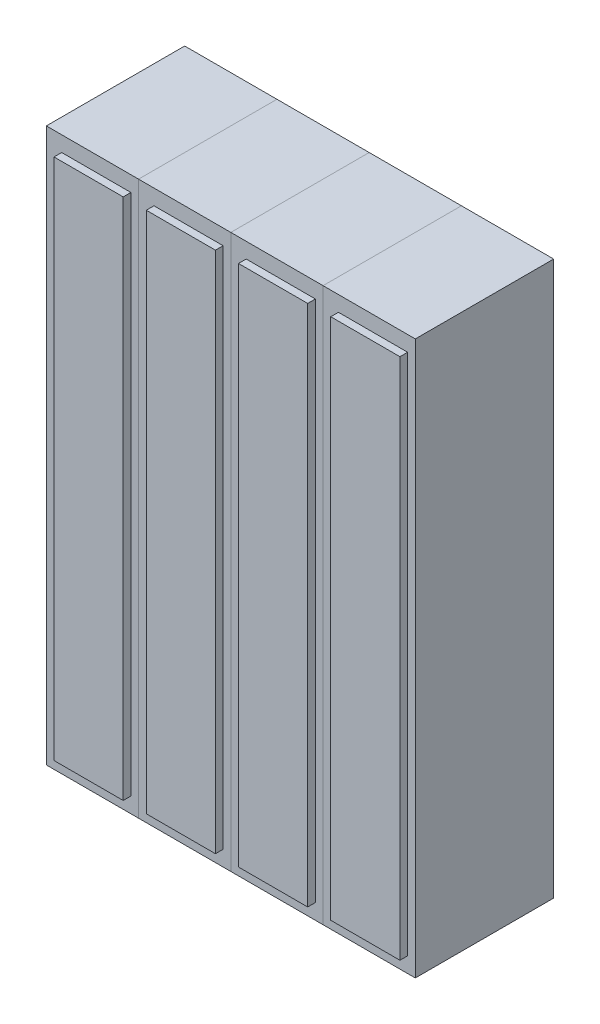
ISO-10303-21;
HEADER;
FILE_DESCRIPTION(('STEP AP214'),'2;1');
FILE_NAME('part.step','',(''),(''),'','','');
FILE_SCHEMA(('AUTOMOTIVE_DESIGN { 1 0 10303 214 1 1 1 1 }'));
ENDSEC;
DATA;
#1=APPLICATION_CONTEXT('core data for automotive mechanical design processes');
#2=APPLICATION_PROTOCOL_DEFINITION('international standard','automotive_design',2000,#1);
#3=PRODUCT_CONTEXT('',#1,'mechanical');
#4=PRODUCT('Part','Part','',(#3));
#5=PRODUCT_RELATED_PRODUCT_CATEGORY('part','',(#4));
#6=PRODUCT_DEFINITION_FORMATION('','',#4);
#7=PRODUCT_DEFINITION_CONTEXT('part definition',#1,'design');
#8=PRODUCT_DEFINITION('design','',#6,#7);
#9=PRODUCT_DEFINITION_SHAPE('','',#8);
#10=(LENGTH_UNIT() NAMED_UNIT(*) SI_UNIT(.MILLI.,.METRE.));
#11=(NAMED_UNIT(*) PLANE_ANGLE_UNIT() SI_UNIT($,.RADIAN.));
#12=(NAMED_UNIT(*) SI_UNIT($,.STERADIAN.) SOLID_ANGLE_UNIT());
#13=UNCERTAINTY_MEASURE_WITH_UNIT(LENGTH_MEASURE(1.E-05),#10,'distance_accuracy_value','');
#14=(GEOMETRIC_REPRESENTATION_CONTEXT(3) GLOBAL_UNCERTAINTY_ASSIGNED_CONTEXT((#13)) GLOBAL_UNIT_ASSIGNED_CONTEXT((#10,
#11,#12)) REPRESENTATION_CONTEXT('',''));
#15=CARTESIAN_POINT('',(0.,0.,0.));
#16=DIRECTION('',(0.,0.,1.));
#17=DIRECTION('',(1.,0.,0.));
#18=AXIS2_PLACEMENT_3D('',#15,#16,#17);
#19=CARTESIAN_POINT('',(914.4,1828.8,457.2));
#20=DIRECTION('',(0.,0.,-1.));
#21=DIRECTION('',(-1.,0.,0.));
#22=AXIS2_PLACEMENT_3D('',#19,#20,#21);
#23=PLANE('',#22);
#24=DIRECTION('',(1.,0.,0.));
#25=VECTOR('',#24,1.);
#26=CARTESIAN_POINT('',(914.4,0.,457.2));
#27=LINE('',#26,#25);
#28=CARTESIAN_POINT('',(914.4,0.,457.2));
#29=VERTEX_POINT('',#28);
#30=CARTESIAN_POINT('',(1219.2,0.,457.2));
#31=VERTEX_POINT('',#30);
#32=EDGE_CURVE('E138',#29,#31,#27,.T.);
#33=ORIENTED_EDGE('',*,*,#32,.T.);
#34=DIRECTION('',(0.,-1.,0.));
#35=VECTOR('',#34,1.);
#36=CARTESIAN_POINT('',(1219.2,1828.8,457.2));
#37=LINE('',#36,#35);
#38=CARTESIAN_POINT('',(1219.2,1828.8,457.2));
#39=VERTEX_POINT('',#38);
#40=EDGE_CURVE('E58',#39,#31,#37,.T.);
#41=ORIENTED_EDGE('',*,*,#40,.F.);
#42=DIRECTION('',(1.,0.,0.));
#43=VECTOR('',#42,1.);
#44=CARTESIAN_POINT('',(914.4,1828.8,457.2));
#45=LINE('',#44,#43);
#46=CARTESIAN_POINT('',(914.4,1828.8,457.2));
#47=VERTEX_POINT('',#46);
#48=EDGE_CURVE('E147',#47,#39,#45,.T.);
#49=ORIENTED_EDGE('',*,*,#48,.F.);
#50=DIRECTION('',(0.,-1.,0.));
#51=VECTOR('',#50,1.);
#52=CARTESIAN_POINT('',(914.4,1828.8,457.2));
#53=LINE('',#52,#51);
#54=EDGE_CURVE('E12',#47,#29,#53,.T.);
#55=ORIENTED_EDGE('',*,*,#54,.T.);
#56=EDGE_LOOP('',(#33,#41,#49,#55));
#57=FACE_BOUND('',#56,.T.);
#58=DIRECTION('',(0.,1.,0.));
#59=VECTOR('',#58,1.);
#60=CARTESIAN_POINT('',(1193.8,1778.,457.2));
#61=LINE('',#60,#59);
#62=CARTESIAN_POINT('',(1193.8,50.8,457.2));
#63=VERTEX_POINT('',#62);
#64=CARTESIAN_POINT('',(1193.8,1778.,457.2));
#65=VERTEX_POINT('',#64);
#66=EDGE_CURVE('E65',#63,#65,#61,.T.);
#67=ORIENTED_EDGE('',*,*,#66,.F.);
#68=DIRECTION('',(1.,0.,0.));
#69=VECTOR('',#68,1.);
#70=CARTESIAN_POINT('',(1193.8,50.8,457.2));
#71=LINE('',#70,#69);
#72=CARTESIAN_POINT('',(965.2,50.8,457.2));
#73=VERTEX_POINT('',#72);
#74=EDGE_CURVE('E69',#73,#63,#71,.T.);
#75=ORIENTED_EDGE('',*,*,#74,.F.);
#76=DIRECTION('',(0.,-1.,0.));
#77=VECTOR('',#76,1.);
#78=CARTESIAN_POINT('',(965.2,1778.,457.2));
#79=LINE('',#78,#77);
#80=CARTESIAN_POINT('',(965.2,1778.,457.2));
#81=VERTEX_POINT('',#80);
#82=EDGE_CURVE('E321',#81,#73,#79,.T.);
#83=ORIENTED_EDGE('',*,*,#82,.F.);
#84=DIRECTION('',(-1.,0.,0.));
#85=VECTOR('',#84,1.);
#86=CARTESIAN_POINT('',(1193.8,1778.,457.2));
#87=LINE('',#86,#85);
#88=EDGE_CURVE('E327',#65,#81,#87,.T.);
#89=ORIENTED_EDGE('',*,*,#88,.F.);
#90=EDGE_LOOP('',(#67,#75,#83,#89));
#91=FACE_BOUND('',#90,.T.);
#92=ADVANCED_FACE('F50',(#57,#91),#23,.F.);
#93=CARTESIAN_POINT('',(914.4,1828.8,0.));
#94=DIRECTION('',(1.,0.,0.));
#95=DIRECTION('',(0.,0.,-1.));
#96=AXIS2_PLACEMENT_3D('',#93,#94,#95);
#97=PLANE('',#96);
#98=DIRECTION('',(0.,0.,1.));
#99=VECTOR('',#98,1.);
#100=CARTESIAN_POINT('',(914.4,0.,0.));
#101=LINE('',#100,#99);
#102=CARTESIAN_POINT('',(914.4,0.,0.));
#103=VERTEX_POINT('',#102);
#104=EDGE_CURVE('E135',#103,#29,#101,.T.);
#105=ORIENTED_EDGE('',*,*,#104,.T.);
#106=ORIENTED_EDGE('',*,*,#54,.F.);
#107=DIRECTION('',(0.,0.,1.));
#108=VECTOR('',#107,1.);
#109=CARTESIAN_POINT('',(914.4,1828.8,0.));
#110=LINE('',#109,#108);
#111=CARTESIAN_POINT('',(914.4,1828.8,0.));
#112=VERTEX_POINT('',#111);
#113=EDGE_CURVE('E144',#112,#47,#110,.T.);
#114=ORIENTED_EDGE('',*,*,#113,.F.);
#115=DIRECTION('',(0.,-1.,0.));
#116=VECTOR('',#115,1.);
#117=CARTESIAN_POINT('',(914.4,1828.8,0.));
#118=LINE('',#117,#116);
#119=EDGE_CURVE('E153',#112,#103,#118,.T.);
#120=ORIENTED_EDGE('',*,*,#119,.T.);
#121=EDGE_LOOP('',(#105,#106,#114,#120));
#122=FACE_BOUND('',#121,.T.);
#123=ADVANCED_FACE('F52',(#122),#97,.F.);
#124=CARTESIAN_POINT('',(1219.2,1828.8,0.));
#125=DIRECTION('',(-1.,0.,0.));
#126=DIRECTION('',(0.,0.,1.));
#127=AXIS2_PLACEMENT_3D('',#124,#125,#126);
#128=PLANE('',#127);
#129=DIRECTION('',(0.,0.,-1.));
#130=VECTOR('',#129,1.);
#131=CARTESIAN_POINT('',(1219.2,0.,0.));
#132=LINE('',#131,#130);
#133=CARTESIAN_POINT('',(1219.2,0.,0.));
#134=VERTEX_POINT('',#133);
#135=EDGE_CURVE('E156',#31,#134,#132,.T.);
#136=ORIENTED_EDGE('',*,*,#135,.T.);
#137=DIRECTION('',(0.,-1.,0.));
#138=VECTOR('',#137,1.);
#139=CARTESIAN_POINT('',(1219.2,1828.8,0.));
#140=LINE('',#139,#138);
#141=CARTESIAN_POINT('',(1219.2,1828.8,0.));
#142=VERTEX_POINT('',#141);
#143=EDGE_CURVE('E161',#142,#134,#140,.T.);
#144=ORIENTED_EDGE('',*,*,#143,.F.);
#145=DIRECTION('',(0.,0.,-1.));
#146=VECTOR('',#145,1.);
#147=CARTESIAN_POINT('',(1219.2,1828.8,0.));
#148=LINE('',#147,#146);
#149=EDGE_CURVE('E150',#39,#142,#148,.T.);
#150=ORIENTED_EDGE('',*,*,#149,.F.);
#151=ORIENTED_EDGE('',*,*,#40,.T.);
#152=EDGE_LOOP('',(#136,#144,#150,#151));
#153=FACE_BOUND('',#152,.T.);
#154=ADVANCED_FACE('F168',(#153),#128,.F.);
#155=CARTESIAN_POINT('',(914.4,1828.8,0.));
#156=DIRECTION('',(0.,0.,1.));
#157=DIRECTION('',(1.,0.,0.));
#158=AXIS2_PLACEMENT_3D('',#155,#156,#157);
#159=PLANE('',#158);
#160=DIRECTION('',(-1.,0.,0.));
#161=VECTOR('',#160,1.);
#162=CARTESIAN_POINT('',(914.4,0.,0.));
#163=LINE('',#162,#161);
#164=EDGE_CURVE('E148',#134,#103,#163,.T.);
#165=ORIENTED_EDGE('',*,*,#164,.T.);
#166=ORIENTED_EDGE('',*,*,#119,.F.);
#167=DIRECTION('',(-1.,0.,0.));
#168=VECTOR('',#167,1.);
#169=CARTESIAN_POINT('',(914.4,1828.8,0.));
#170=LINE('',#169,#168);
#171=EDGE_CURVE('E152',#142,#112,#170,.T.);
#172=ORIENTED_EDGE('',*,*,#171,.F.);
#173=ORIENTED_EDGE('',*,*,#143,.T.);
#174=EDGE_LOOP('',(#165,#166,#172,#173));
#175=FACE_BOUND('',#174,.T.);
#176=ADVANCED_FACE('F177',(#175),#159,.F.);
#177=CARTESIAN_POINT('',(914.4,1828.8,0.));
#178=DIRECTION('',(0.,1.,0.));
#179=DIRECTION('',(0.,0.,1.));
#180=AXIS2_PLACEMENT_3D('',#177,#178,#179);
#181=PLANE('',#180);
#182=ORIENTED_EDGE('',*,*,#113,.T.);
#183=ORIENTED_EDGE('',*,*,#48,.T.);
#184=ORIENTED_EDGE('',*,*,#149,.T.);
#185=ORIENTED_EDGE('',*,*,#171,.T.);
#186=EDGE_LOOP('',(#182,#183,#184,#185));
#187=FACE_BOUND('',#186,.T.);
#188=ADVANCED_FACE('F183',(#187),#181,.T.);
#189=CARTESIAN_POINT('',(914.4,0.,0.));
#190=DIRECTION('',(0.,1.,0.));
#191=DIRECTION('',(0.,0.,1.));
#192=AXIS2_PLACEMENT_3D('',#189,#190,#191);
#193=PLANE('',#192);
#194=ORIENTED_EDGE('',*,*,#104,.F.);
#195=ORIENTED_EDGE('',*,*,#164,.F.);
#196=ORIENTED_EDGE('',*,*,#135,.F.);
#197=ORIENTED_EDGE('',*,*,#32,.F.);
#198=EDGE_LOOP('',(#194,#195,#196,#197));
#199=FACE_BOUND('',#198,.T.);
#200=ADVANCED_FACE('F174',(#199),#193,.F.);
#201=CARTESIAN_POINT('',(1193.8,1778.,482.6));
#202=DIRECTION('',(-1.,0.,0.));
#203=DIRECTION('',(0.,-1.,0.));
#204=AXIS2_PLACEMENT_3D('',#201,#202,#203);
#205=PLANE('',#204);
#206=ORIENTED_EDGE('',*,*,#66,.T.);
#207=DIRECTION('',(0.,0.,-1.));
#208=VECTOR('',#207,1.);
#209=CARTESIAN_POINT('',(1193.8,1778.,482.6));
#210=LINE('',#209,#208);
#211=CARTESIAN_POINT('',(1193.8,1778.,482.6));
#212=VERTEX_POINT('',#211);
#213=EDGE_CURVE('E118',#212,#65,#210,.T.);
#214=ORIENTED_EDGE('',*,*,#213,.F.);
#215=DIRECTION('',(0.,1.,0.));
#216=VECTOR('',#215,1.);
#217=CARTESIAN_POINT('',(1193.8,1778.,482.6));
#218=LINE('',#217,#216);
#219=CARTESIAN_POINT('',(1193.8,50.8,482.6));
#220=VERTEX_POINT('',#219);
#221=EDGE_CURVE('E124',#220,#212,#218,.T.);
#222=ORIENTED_EDGE('',*,*,#221,.F.);
#223=DIRECTION('',(0.,0.,-1.));
#224=VECTOR('',#223,1.);
#225=CARTESIAN_POINT('',(1193.8,50.8,482.6));
#226=LINE('',#225,#224);
#227=EDGE_CURVE('E319',#220,#63,#226,.T.);
#228=ORIENTED_EDGE('',*,*,#227,.T.);
#229=EDGE_LOOP('',(#206,#214,#222,#228));
#230=FACE_BOUND('',#229,.T.);
#231=ADVANCED_FACE('F134',(#230),#205,.F.);
#232=CARTESIAN_POINT('',(1193.8,1778.,482.6));
#233=DIRECTION('',(0.,-1.,0.));
#234=DIRECTION('',(0.,0.,-1.));
#235=AXIS2_PLACEMENT_3D('',#232,#233,#234);
#236=PLANE('',#235);
#237=ORIENTED_EDGE('',*,*,#88,.T.);
#238=DIRECTION('',(0.,0.,-1.));
#239=VECTOR('',#238,1.);
#240=CARTESIAN_POINT('',(965.2,1778.,482.6));
#241=LINE('',#240,#239);
#242=CARTESIAN_POINT('',(965.2,1778.,482.6));
#243=VERTEX_POINT('',#242);
#244=EDGE_CURVE('E120',#243,#81,#241,.T.);
#245=ORIENTED_EDGE('',*,*,#244,.F.);
#246=DIRECTION('',(-1.,0.,0.));
#247=VECTOR('',#246,1.);
#248=CARTESIAN_POINT('',(1193.8,1778.,482.6));
#249=LINE('',#248,#247);
#250=EDGE_CURVE('E113',#212,#243,#249,.T.);
#251=ORIENTED_EDGE('',*,*,#250,.F.);
#252=ORIENTED_EDGE('',*,*,#213,.T.);
#253=EDGE_LOOP('',(#237,#245,#251,#252));
#254=FACE_BOUND('',#253,.T.);
#255=ADVANCED_FACE('F116',(#254),#236,.F.);
#256=CARTESIAN_POINT('',(965.2,1778.,482.6));
#257=DIRECTION('',(1.,0.,0.));
#258=DIRECTION('',(0.,1.,0.));
#259=AXIS2_PLACEMENT_3D('',#256,#257,#258);
#260=PLANE('',#259);
#261=ORIENTED_EDGE('',*,*,#82,.T.);
#262=DIRECTION('',(0.,0.,-1.));
#263=VECTOR('',#262,1.);
#264=CARTESIAN_POINT('',(965.2,50.8,482.6));
#265=LINE('',#264,#263);
#266=CARTESIAN_POINT('',(965.2,50.8,482.6));
#267=VERTEX_POINT('',#266);
#268=EDGE_CURVE('E140',#267,#73,#265,.T.);
#269=ORIENTED_EDGE('',*,*,#268,.F.);
#270=DIRECTION('',(0.,-1.,0.));
#271=VECTOR('',#270,1.);
#272=CARTESIAN_POINT('',(965.2,1778.,482.6));
#273=LINE('',#272,#271);
#274=EDGE_CURVE('E123',#243,#267,#273,.T.);
#275=ORIENTED_EDGE('',*,*,#274,.F.);
#276=ORIENTED_EDGE('',*,*,#244,.T.);
#277=EDGE_LOOP('',(#261,#269,#275,#276));
#278=FACE_BOUND('',#277,.T.);
#279=ADVANCED_FACE('F201',(#278),#260,.F.);
#280=CARTESIAN_POINT('',(1193.8,50.8,482.6));
#281=DIRECTION('',(0.,1.,0.));
#282=DIRECTION('',(-1.,0.,0.));
#283=AXIS2_PLACEMENT_3D('',#280,#281,#282);
#284=PLANE('',#283);
#285=ORIENTED_EDGE('',*,*,#74,.T.);
#286=ORIENTED_EDGE('',*,*,#227,.F.);
#287=DIRECTION('',(1.,0.,0.));
#288=VECTOR('',#287,1.);
#289=CARTESIAN_POINT('',(1193.8,50.8,482.6));
#290=LINE('',#289,#288);
#291=EDGE_CURVE('E129',#267,#220,#290,.T.);
#292=ORIENTED_EDGE('',*,*,#291,.F.);
#293=ORIENTED_EDGE('',*,*,#268,.T.);
#294=EDGE_LOOP('',(#285,#286,#292,#293));
#295=FACE_BOUND('',#294,.T.);
#296=ADVANCED_FACE('F204',(#295),#284,.F.);
#297=CARTESIAN_POINT('',(914.4,0.,482.6));
#298=DIRECTION('',(0.,0.,-1.));
#299=DIRECTION('',(-1.,0.,0.));
#300=AXIS2_PLACEMENT_3D('',#297,#298,#299);
#301=PLANE('',#300);
#302=ORIENTED_EDGE('',*,*,#221,.T.);
#303=ORIENTED_EDGE('',*,*,#250,.T.);
#304=ORIENTED_EDGE('',*,*,#274,.T.);
#305=ORIENTED_EDGE('',*,*,#291,.T.);
#306=EDGE_LOOP('',(#302,#303,#304,#305));
#307=FACE_BOUND('',#306,.T.);
#308=ADVANCED_FACE('F127',(#307),#301,.F.);
#309=CLOSED_SHELL('',(#92,#123,#154,#176,#188,#200,#231,#255,#279,#296,#308));
#310=MANIFOLD_SOLID_BREP('B2',#309);
#311=CARTESIAN_POINT('',(609.6,1828.8,457.2));
#312=DIRECTION('',(0.,0.,-1.));
#313=DIRECTION('',(-1.,0.,0.));
#314=AXIS2_PLACEMENT_3D('',#311,#312,#313);
#315=PLANE('',#314);
#316=DIRECTION('',(1.,0.,0.));
#317=VECTOR('',#316,1.);
#318=CARTESIAN_POINT('',(609.6,0.,457.2));
#319=LINE('',#318,#317);
#320=CARTESIAN_POINT('',(609.6,0.,457.2));
#321=VERTEX_POINT('',#320);
#322=CARTESIAN_POINT('',(914.4,0.,457.2));
#323=VERTEX_POINT('',#322);
#324=EDGE_CURVE('E431',#321,#323,#319,.T.);
#325=ORIENTED_EDGE('',*,*,#324,.T.);
#326=DIRECTION('',(0.,-1.,0.));
#327=VECTOR('',#326,1.);
#328=CARTESIAN_POINT('',(914.4,1828.8,457.2));
#329=LINE('',#328,#327);
#330=CARTESIAN_POINT('',(914.4,1828.8,457.2));
#331=VERTEX_POINT('',#330);
#332=EDGE_CURVE('E351',#331,#323,#329,.T.);
#333=ORIENTED_EDGE('',*,*,#332,.F.);
#334=DIRECTION('',(1.,0.,0.));
#335=VECTOR('',#334,1.);
#336=CARTESIAN_POINT('',(609.6,1828.8,457.2));
#337=LINE('',#336,#335);
#338=CARTESIAN_POINT('',(609.6,1828.8,457.2));
#339=VERTEX_POINT('',#338);
#340=EDGE_CURVE('E440',#339,#331,#337,.T.);
#341=ORIENTED_EDGE('',*,*,#340,.F.);
#342=DIRECTION('',(0.,-1.,0.));
#343=VECTOR('',#342,1.);
#344=CARTESIAN_POINT('',(609.6,1828.8,457.2));
#345=LINE('',#344,#343);
#346=EDGE_CURVE('E48',#339,#321,#345,.T.);
#347=ORIENTED_EDGE('',*,*,#346,.T.);
#348=EDGE_LOOP('',(#325,#333,#341,#347));
#349=FACE_BOUND('',#348,.T.);
#350=DIRECTION('',(0.,1.,0.));
#351=VECTOR('',#350,1.);
#352=CARTESIAN_POINT('',(889.,1778.,457.2));
#353=LINE('',#352,#351);
#354=CARTESIAN_POINT('',(889.,50.8,457.2));
#355=VERTEX_POINT('',#354);
#356=CARTESIAN_POINT('',(889.,1778.,457.2));
#357=VERTEX_POINT('',#356);
#358=EDGE_CURVE('E358',#355,#357,#353,.T.);
#359=ORIENTED_EDGE('',*,*,#358,.F.);
#360=DIRECTION('',(1.,0.,0.));
#361=VECTOR('',#360,1.);
#362=CARTESIAN_POINT('',(889.,50.8,457.2));
#363=LINE('',#362,#361);
#364=CARTESIAN_POINT('',(660.4,50.8,457.2));
#365=VERTEX_POINT('',#364);
#366=EDGE_CURVE('E362',#365,#355,#363,.T.);
#367=ORIENTED_EDGE('',*,*,#366,.F.);
#368=DIRECTION('',(0.,-1.,0.));
#369=VECTOR('',#368,1.);
#370=CARTESIAN_POINT('',(660.4,1778.,457.2));
#371=LINE('',#370,#369);
#372=CARTESIAN_POINT('',(660.4,1778.,457.2));
#373=VERTEX_POINT('',#372);
#374=EDGE_CURVE('E614',#373,#365,#371,.T.);
#375=ORIENTED_EDGE('',*,*,#374,.F.);
#376=DIRECTION('',(-1.,0.,0.));
#377=VECTOR('',#376,1.);
#378=CARTESIAN_POINT('',(889.,1778.,457.2));
#379=LINE('',#378,#377);
#380=EDGE_CURVE('E620',#357,#373,#379,.T.);
#381=ORIENTED_EDGE('',*,*,#380,.F.);
#382=EDGE_LOOP('',(#359,#367,#375,#381));
#383=FACE_BOUND('',#382,.T.);
#384=ADVANCED_FACE('F343',(#349,#383),#315,.F.);
#385=CARTESIAN_POINT('',(609.6,1828.8,0.));
#386=DIRECTION('',(1.,0.,0.));
#387=DIRECTION('',(0.,0.,-1.));
#388=AXIS2_PLACEMENT_3D('',#385,#386,#387);
#389=PLANE('',#388);
#390=DIRECTION('',(0.,0.,1.));
#391=VECTOR('',#390,1.);
#392=CARTESIAN_POINT('',(609.6,0.,0.));
#393=LINE('',#392,#391);
#394=CARTESIAN_POINT('',(609.6,0.,0.));
#395=VERTEX_POINT('',#394);
#396=EDGE_CURVE('E428',#395,#321,#393,.T.);
#397=ORIENTED_EDGE('',*,*,#396,.T.);
#398=ORIENTED_EDGE('',*,*,#346,.F.);
#399=DIRECTION('',(0.,0.,1.));
#400=VECTOR('',#399,1.);
#401=CARTESIAN_POINT('',(609.6,1828.8,0.));
#402=LINE('',#401,#400);
#403=CARTESIAN_POINT('',(609.6,1828.8,0.));
#404=VERTEX_POINT('',#403);
#405=EDGE_CURVE('E437',#404,#339,#402,.T.);
#406=ORIENTED_EDGE('',*,*,#405,.F.);
#407=DIRECTION('',(0.,-1.,0.));
#408=VECTOR('',#407,1.);
#409=CARTESIAN_POINT('',(609.6,1828.8,0.));
#410=LINE('',#409,#408);
#411=EDGE_CURVE('E446',#404,#395,#410,.T.);
#412=ORIENTED_EDGE('',*,*,#411,.T.);
#413=EDGE_LOOP('',(#397,#398,#406,#412));
#414=FACE_BOUND('',#413,.T.);
#415=ADVANCED_FACE('F345',(#414),#389,.F.);
#416=CARTESIAN_POINT('',(914.4,1828.8,0.));
#417=DIRECTION('',(-1.,0.,0.));
#418=DIRECTION('',(0.,0.,1.));
#419=AXIS2_PLACEMENT_3D('',#416,#417,#418);
#420=PLANE('',#419);
#421=DIRECTION('',(0.,0.,-1.));
#422=VECTOR('',#421,1.);
#423=CARTESIAN_POINT('',(914.4,0.,0.));
#424=LINE('',#423,#422);
#425=CARTESIAN_POINT('',(914.4,0.,0.));
#426=VERTEX_POINT('',#425);
#427=EDGE_CURVE('E449',#323,#426,#424,.T.);
#428=ORIENTED_EDGE('',*,*,#427,.T.);
#429=DIRECTION('',(0.,-1.,0.));
#430=VECTOR('',#429,1.);
#431=CARTESIAN_POINT('',(914.4,1828.8,0.));
#432=LINE('',#431,#430);
#433=CARTESIAN_POINT('',(914.4,1828.8,0.));
#434=VERTEX_POINT('',#433);
#435=EDGE_CURVE('E454',#434,#426,#432,.T.);
#436=ORIENTED_EDGE('',*,*,#435,.F.);
#437=DIRECTION('',(0.,0.,-1.));
#438=VECTOR('',#437,1.);
#439=CARTESIAN_POINT('',(914.4,1828.8,0.));
#440=LINE('',#439,#438);
#441=EDGE_CURVE('E443',#331,#434,#440,.T.);
#442=ORIENTED_EDGE('',*,*,#441,.F.);
#443=ORIENTED_EDGE('',*,*,#332,.T.);
#444=EDGE_LOOP('',(#428,#436,#442,#443));
#445=FACE_BOUND('',#444,.T.);
#446=ADVANCED_FACE('F461',(#445),#420,.F.);
#447=CARTESIAN_POINT('',(609.6,1828.8,0.));
#448=DIRECTION('',(0.,0.,1.));
#449=DIRECTION('',(1.,0.,0.));
#450=AXIS2_PLACEMENT_3D('',#447,#448,#449);
#451=PLANE('',#450);
#452=DIRECTION('',(-1.,0.,0.));
#453=VECTOR('',#452,1.);
#454=CARTESIAN_POINT('',(609.6,0.,0.));
#455=LINE('',#454,#453);
#456=EDGE_CURVE('E441',#426,#395,#455,.T.);
#457=ORIENTED_EDGE('',*,*,#456,.T.);
#458=ORIENTED_EDGE('',*,*,#411,.F.);
#459=DIRECTION('',(-1.,0.,0.));
#460=VECTOR('',#459,1.);
#461=CARTESIAN_POINT('',(609.6,1828.8,0.));
#462=LINE('',#461,#460);
#463=EDGE_CURVE('E445',#434,#404,#462,.T.);
#464=ORIENTED_EDGE('',*,*,#463,.F.);
#465=ORIENTED_EDGE('',*,*,#435,.T.);
#466=EDGE_LOOP('',(#457,#458,#464,#465));
#467=FACE_BOUND('',#466,.T.);
#468=ADVANCED_FACE('F470',(#467),#451,.F.);
#469=CARTESIAN_POINT('',(609.6,1828.8,0.));
#470=DIRECTION('',(0.,1.,0.));
#471=DIRECTION('',(0.,0.,1.));
#472=AXIS2_PLACEMENT_3D('',#469,#470,#471);
#473=PLANE('',#472);
#474=ORIENTED_EDGE('',*,*,#405,.T.);
#475=ORIENTED_EDGE('',*,*,#340,.T.);
#476=ORIENTED_EDGE('',*,*,#441,.T.);
#477=ORIENTED_EDGE('',*,*,#463,.T.);
#478=EDGE_LOOP('',(#474,#475,#476,#477));
#479=FACE_BOUND('',#478,.T.);
#480=ADVANCED_FACE('F476',(#479),#473,.T.);
#481=CARTESIAN_POINT('',(609.6,0.,0.));
#482=DIRECTION('',(0.,1.,0.));
#483=DIRECTION('',(0.,0.,1.));
#484=AXIS2_PLACEMENT_3D('',#481,#482,#483);
#485=PLANE('',#484);
#486=ORIENTED_EDGE('',*,*,#396,.F.);
#487=ORIENTED_EDGE('',*,*,#456,.F.);
#488=ORIENTED_EDGE('',*,*,#427,.F.);
#489=ORIENTED_EDGE('',*,*,#324,.F.);
#490=EDGE_LOOP('',(#486,#487,#488,#489));
#491=FACE_BOUND('',#490,.T.);
#492=ADVANCED_FACE('F467',(#491),#485,.F.);
#493=CARTESIAN_POINT('',(889.,1778.,482.6));
#494=DIRECTION('',(-1.,0.,0.));
#495=DIRECTION('',(0.,-1.,0.));
#496=AXIS2_PLACEMENT_3D('',#493,#494,#495);
#497=PLANE('',#496);
#498=ORIENTED_EDGE('',*,*,#358,.T.);
#499=DIRECTION('',(0.,0.,-1.));
#500=VECTOR('',#499,1.);
#501=CARTESIAN_POINT('',(889.,1778.,482.6));
#502=LINE('',#501,#500);
#503=CARTESIAN_POINT('',(889.,1778.,482.6));
#504=VERTEX_POINT('',#503);
#505=EDGE_CURVE('E411',#504,#357,#502,.T.);
#506=ORIENTED_EDGE('',*,*,#505,.F.);
#507=DIRECTION('',(0.,1.,0.));
#508=VECTOR('',#507,1.);
#509=CARTESIAN_POINT('',(889.,1778.,482.6));
#510=LINE('',#509,#508);
#511=CARTESIAN_POINT('',(889.,50.8,482.6));
#512=VERTEX_POINT('',#511);
#513=EDGE_CURVE('E417',#512,#504,#510,.T.);
#514=ORIENTED_EDGE('',*,*,#513,.F.);
#515=DIRECTION('',(0.,0.,-1.));
#516=VECTOR('',#515,1.);
#517=CARTESIAN_POINT('',(889.,50.8,482.6));
#518=LINE('',#517,#516);
#519=EDGE_CURVE('E612',#512,#355,#518,.T.);
#520=ORIENTED_EDGE('',*,*,#519,.T.);
#521=EDGE_LOOP('',(#498,#506,#514,#520));
#522=FACE_BOUND('',#521,.T.);
#523=ADVANCED_FACE('F427',(#522),#497,.F.);
#524=CARTESIAN_POINT('',(889.,1778.,482.6));
#525=DIRECTION('',(0.,-1.,0.));
#526=DIRECTION('',(0.,0.,-1.));
#527=AXIS2_PLACEMENT_3D('',#524,#525,#526);
#528=PLANE('',#527);
#529=ORIENTED_EDGE('',*,*,#380,.T.);
#530=DIRECTION('',(0.,0.,-1.));
#531=VECTOR('',#530,1.);
#532=CARTESIAN_POINT('',(660.4,1778.,482.6));
#533=LINE('',#532,#531);
#534=CARTESIAN_POINT('',(660.4,1778.,482.6));
#535=VERTEX_POINT('',#534);
#536=EDGE_CURVE('E413',#535,#373,#533,.T.);
#537=ORIENTED_EDGE('',*,*,#536,.F.);
#538=DIRECTION('',(-1.,0.,0.));
#539=VECTOR('',#538,1.);
#540=CARTESIAN_POINT('',(889.,1778.,482.6));
#541=LINE('',#540,#539);
#542=EDGE_CURVE('E406',#504,#535,#541,.T.);
#543=ORIENTED_EDGE('',*,*,#542,.F.);
#544=ORIENTED_EDGE('',*,*,#505,.T.);
#545=EDGE_LOOP('',(#529,#537,#543,#544));
#546=FACE_BOUND('',#545,.T.);
#547=ADVANCED_FACE('F409',(#546),#528,.F.);
#548=CARTESIAN_POINT('',(660.4,1778.,482.6));
#549=DIRECTION('',(1.,0.,0.));
#550=DIRECTION('',(0.,1.,0.));
#551=AXIS2_PLACEMENT_3D('',#548,#549,#550);
#552=PLANE('',#551);
#553=ORIENTED_EDGE('',*,*,#374,.T.);
#554=DIRECTION('',(0.,0.,-1.));
#555=VECTOR('',#554,1.);
#556=CARTESIAN_POINT('',(660.4,50.8,482.6));
#557=LINE('',#556,#555);
#558=CARTESIAN_POINT('',(660.4,50.8,482.6));
#559=VERTEX_POINT('',#558);
#560=EDGE_CURVE('E433',#559,#365,#557,.T.);
#561=ORIENTED_EDGE('',*,*,#560,.F.);
#562=DIRECTION('',(0.,-1.,0.));
#563=VECTOR('',#562,1.);
#564=CARTESIAN_POINT('',(660.4,1778.,482.6));
#565=LINE('',#564,#563);
#566=EDGE_CURVE('E416',#535,#559,#565,.T.);
#567=ORIENTED_EDGE('',*,*,#566,.F.);
#568=ORIENTED_EDGE('',*,*,#536,.T.);
#569=EDGE_LOOP('',(#553,#561,#567,#568));
#570=FACE_BOUND('',#569,.T.);
#571=ADVANCED_FACE('F494',(#570),#552,.F.);
#572=CARTESIAN_POINT('',(889.,50.8,482.6));
#573=DIRECTION('',(0.,1.,0.));
#574=DIRECTION('',(-1.,0.,0.));
#575=AXIS2_PLACEMENT_3D('',#572,#573,#574);
#576=PLANE('',#575);
#577=ORIENTED_EDGE('',*,*,#366,.T.);
#578=ORIENTED_EDGE('',*,*,#519,.F.);
#579=DIRECTION('',(1.,0.,0.));
#580=VECTOR('',#579,1.);
#581=CARTESIAN_POINT('',(889.,50.8,482.6));
#582=LINE('',#581,#580);
#583=EDGE_CURVE('E422',#559,#512,#582,.T.);
#584=ORIENTED_EDGE('',*,*,#583,.F.);
#585=ORIENTED_EDGE('',*,*,#560,.T.);
#586=EDGE_LOOP('',(#577,#578,#584,#585));
#587=FACE_BOUND('',#586,.T.);
#588=ADVANCED_FACE('F497',(#587),#576,.F.);
#589=CARTESIAN_POINT('',(609.6,0.,482.6));
#590=DIRECTION('',(0.,0.,-1.));
#591=DIRECTION('',(-1.,0.,0.));
#592=AXIS2_PLACEMENT_3D('',#589,#590,#591);
#593=PLANE('',#592);
#594=ORIENTED_EDGE('',*,*,#513,.T.);
#595=ORIENTED_EDGE('',*,*,#542,.T.);
#596=ORIENTED_EDGE('',*,*,#566,.T.);
#597=ORIENTED_EDGE('',*,*,#583,.T.);
#598=EDGE_LOOP('',(#594,#595,#596,#597));
#599=FACE_BOUND('',#598,.T.);
#600=ADVANCED_FACE('F420',(#599),#593,.F.);
#601=CLOSED_SHELL('',(#384,#415,#446,#468,#480,#492,#523,#547,#571,#588,#600));
#602=MANIFOLD_SOLID_BREP('B6',#601);
#603=CARTESIAN_POINT('',(304.8,1828.8,457.2));
#604=DIRECTION('',(0.,0.,-1.));
#605=DIRECTION('',(-1.,0.,0.));
#606=AXIS2_PLACEMENT_3D('',#603,#604,#605);
#607=PLANE('',#606);
#608=DIRECTION('',(1.,0.,0.));
#609=VECTOR('',#608,1.);
#610=CARTESIAN_POINT('',(304.8,0.,457.2));
#611=LINE('',#610,#609);
#612=CARTESIAN_POINT('',(304.8,0.,457.2));
#613=VERTEX_POINT('',#612);
#614=CARTESIAN_POINT('',(609.6,0.,457.2));
#615=VERTEX_POINT('',#614);
#616=EDGE_CURVE('E723',#613,#615,#611,.T.);
#617=ORIENTED_EDGE('',*,*,#616,.T.);
#618=DIRECTION('',(0.,-1.,0.));
#619=VECTOR('',#618,1.);
#620=CARTESIAN_POINT('',(609.6,1828.8,457.2));
#621=LINE('',#620,#619);
#622=CARTESIAN_POINT('',(609.6,1828.8,457.2));
#623=VERTEX_POINT('',#622);
#624=EDGE_CURVE('E643',#623,#615,#621,.T.);
#625=ORIENTED_EDGE('',*,*,#624,.F.);
#626=DIRECTION('',(1.,0.,0.));
#627=VECTOR('',#626,1.);
#628=CARTESIAN_POINT('',(304.8,1828.8,457.2));
#629=LINE('',#628,#627);
#630=CARTESIAN_POINT('',(304.8,1828.8,457.2));
#631=VERTEX_POINT('',#630);
#632=EDGE_CURVE('E732',#631,#623,#629,.T.);
#633=ORIENTED_EDGE('',*,*,#632,.F.);
#634=DIRECTION('',(0.,-1.,0.));
#635=VECTOR('',#634,1.);
#636=CARTESIAN_POINT('',(304.8,1828.8,457.2));
#637=LINE('',#636,#635);
#638=EDGE_CURVE('E341',#631,#613,#637,.T.);
#639=ORIENTED_EDGE('',*,*,#638,.T.);
#640=EDGE_LOOP('',(#617,#625,#633,#639));
#641=FACE_BOUND('',#640,.T.);
#642=DIRECTION('',(0.,1.,0.));
#643=VECTOR('',#642,1.);
#644=CARTESIAN_POINT('',(584.2,1778.,457.2));
#645=LINE('',#644,#643);
#646=CARTESIAN_POINT('',(584.2,50.8,457.2));
#647=VERTEX_POINT('',#646);
#648=CARTESIAN_POINT('',(584.2,1778.,457.2));
#649=VERTEX_POINT('',#648);
#650=EDGE_CURVE('E650',#647,#649,#645,.T.);
#651=ORIENTED_EDGE('',*,*,#650,.F.);
#652=DIRECTION('',(1.,0.,0.));
#653=VECTOR('',#652,1.);
#654=CARTESIAN_POINT('',(584.2,50.8,457.2));
#655=LINE('',#654,#653);
#656=CARTESIAN_POINT('',(355.6,50.8,457.2));
#657=VERTEX_POINT('',#656);
#658=EDGE_CURVE('E654',#657,#647,#655,.T.);
#659=ORIENTED_EDGE('',*,*,#658,.F.);
#660=DIRECTION('',(0.,-1.,0.));
#661=VECTOR('',#660,1.);
#662=CARTESIAN_POINT('',(355.6,1778.,457.2));
#663=LINE('',#662,#661);
#664=CARTESIAN_POINT('',(355.6,1778.,457.2));
#665=VERTEX_POINT('',#664);
#666=EDGE_CURVE('E906',#665,#657,#663,.T.);
#667=ORIENTED_EDGE('',*,*,#666,.F.);
#668=DIRECTION('',(-1.,0.,0.));
#669=VECTOR('',#668,1.);
#670=CARTESIAN_POINT('',(584.2,1778.,457.2));
#671=LINE('',#670,#669);
#672=EDGE_CURVE('E912',#649,#665,#671,.T.);
#673=ORIENTED_EDGE('',*,*,#672,.F.);
#674=EDGE_LOOP('',(#651,#659,#667,#673));
#675=FACE_BOUND('',#674,.T.);
#676=ADVANCED_FACE('F635',(#641,#675),#607,.F.);
#677=CARTESIAN_POINT('',(304.8,1828.8,0.));
#678=DIRECTION('',(1.,0.,0.));
#679=DIRECTION('',(0.,0.,-1.));
#680=AXIS2_PLACEMENT_3D('',#677,#678,#679);
#681=PLANE('',#680);
#682=DIRECTION('',(0.,0.,1.));
#683=VECTOR('',#682,1.);
#684=CARTESIAN_POINT('',(304.8,0.,0.));
#685=LINE('',#684,#683);
#686=CARTESIAN_POINT('',(304.8,0.,0.));
#687=VERTEX_POINT('',#686);
#688=EDGE_CURVE('E720',#687,#613,#685,.T.);
#689=ORIENTED_EDGE('',*,*,#688,.T.);
#690=ORIENTED_EDGE('',*,*,#638,.F.);
#691=DIRECTION('',(0.,0.,1.));
#692=VECTOR('',#691,1.);
#693=CARTESIAN_POINT('',(304.8,1828.8,0.));
#694=LINE('',#693,#692);
#695=CARTESIAN_POINT('',(304.8,1828.8,0.));
#696=VERTEX_POINT('',#695);
#697=EDGE_CURVE('E729',#696,#631,#694,.T.);
#698=ORIENTED_EDGE('',*,*,#697,.F.);
#699=DIRECTION('',(0.,-1.,0.));
#700=VECTOR('',#699,1.);
#701=CARTESIAN_POINT('',(304.8,1828.8,0.));
#702=LINE('',#701,#700);
#703=EDGE_CURVE('E738',#696,#687,#702,.T.);
#704=ORIENTED_EDGE('',*,*,#703,.T.);
#705=EDGE_LOOP('',(#689,#690,#698,#704));
#706=FACE_BOUND('',#705,.T.);
#707=ADVANCED_FACE('F637',(#706),#681,.F.);
#708=CARTESIAN_POINT('',(609.6,1828.8,0.));
#709=DIRECTION('',(-1.,0.,0.));
#710=DIRECTION('',(0.,0.,1.));
#711=AXIS2_PLACEMENT_3D('',#708,#709,#710);
#712=PLANE('',#711);
#713=DIRECTION('',(0.,0.,-1.));
#714=VECTOR('',#713,1.);
#715=CARTESIAN_POINT('',(609.6,0.,0.));
#716=LINE('',#715,#714);
#717=CARTESIAN_POINT('',(609.6,0.,0.));
#718=VERTEX_POINT('',#717);
#719=EDGE_CURVE('E741',#615,#718,#716,.T.);
#720=ORIENTED_EDGE('',*,*,#719,.T.);
#721=DIRECTION('',(0.,-1.,0.));
#722=VECTOR('',#721,1.);
#723=CARTESIAN_POINT('',(609.6,1828.8,0.));
#724=LINE('',#723,#722);
#725=CARTESIAN_POINT('',(609.6,1828.8,0.));
#726=VERTEX_POINT('',#725);
#727=EDGE_CURVE('E746',#726,#718,#724,.T.);
#728=ORIENTED_EDGE('',*,*,#727,.F.);
#729=DIRECTION('',(0.,0.,-1.));
#730=VECTOR('',#729,1.);
#731=CARTESIAN_POINT('',(609.6,1828.8,0.));
#732=LINE('',#731,#730);
#733=EDGE_CURVE('E735',#623,#726,#732,.T.);
#734=ORIENTED_EDGE('',*,*,#733,.F.);
#735=ORIENTED_EDGE('',*,*,#624,.T.);
#736=EDGE_LOOP('',(#720,#728,#734,#735));
#737=FACE_BOUND('',#736,.T.);
#738=ADVANCED_FACE('F753',(#737),#712,.F.);
#739=CARTESIAN_POINT('',(304.8,1828.8,0.));
#740=DIRECTION('',(0.,0.,1.));
#741=DIRECTION('',(1.,0.,0.));
#742=AXIS2_PLACEMENT_3D('',#739,#740,#741);
#743=PLANE('',#742);
#744=DIRECTION('',(-1.,0.,0.));
#745=VECTOR('',#744,1.);
#746=CARTESIAN_POINT('',(304.8,0.,0.));
#747=LINE('',#746,#745);
#748=EDGE_CURVE('E733',#718,#687,#747,.T.);
#749=ORIENTED_EDGE('',*,*,#748,.T.);
#750=ORIENTED_EDGE('',*,*,#703,.F.);
#751=DIRECTION('',(-1.,0.,0.));
#752=VECTOR('',#751,1.);
#753=CARTESIAN_POINT('',(304.8,1828.8,0.));
#754=LINE('',#753,#752);
#755=EDGE_CURVE('E737',#726,#696,#754,.T.);
#756=ORIENTED_EDGE('',*,*,#755,.F.);
#757=ORIENTED_EDGE('',*,*,#727,.T.);
#758=EDGE_LOOP('',(#749,#750,#756,#757));
#759=FACE_BOUND('',#758,.T.);
#760=ADVANCED_FACE('F762',(#759),#743,.F.);
#761=CARTESIAN_POINT('',(304.8,1828.8,0.));
#762=DIRECTION('',(0.,1.,0.));
#763=DIRECTION('',(0.,0.,1.));
#764=AXIS2_PLACEMENT_3D('',#761,#762,#763);
#765=PLANE('',#764);
#766=ORIENTED_EDGE('',*,*,#697,.T.);
#767=ORIENTED_EDGE('',*,*,#632,.T.);
#768=ORIENTED_EDGE('',*,*,#733,.T.);
#769=ORIENTED_EDGE('',*,*,#755,.T.);
#770=EDGE_LOOP('',(#766,#767,#768,#769));
#771=FACE_BOUND('',#770,.T.);
#772=ADVANCED_FACE('F768',(#771),#765,.T.);
#773=CARTESIAN_POINT('',(304.8,0.,0.));
#774=DIRECTION('',(0.,1.,0.));
#775=DIRECTION('',(0.,0.,1.));
#776=AXIS2_PLACEMENT_3D('',#773,#774,#775);
#777=PLANE('',#776);
#778=ORIENTED_EDGE('',*,*,#688,.F.);
#779=ORIENTED_EDGE('',*,*,#748,.F.);
#780=ORIENTED_EDGE('',*,*,#719,.F.);
#781=ORIENTED_EDGE('',*,*,#616,.F.);
#782=EDGE_LOOP('',(#778,#779,#780,#781));
#783=FACE_BOUND('',#782,.T.);
#784=ADVANCED_FACE('F759',(#783),#777,.F.);
#785=CARTESIAN_POINT('',(584.2,1778.,482.6));
#786=DIRECTION('',(-1.,0.,0.));
#787=DIRECTION('',(0.,-1.,0.));
#788=AXIS2_PLACEMENT_3D('',#785,#786,#787);
#789=PLANE('',#788);
#790=ORIENTED_EDGE('',*,*,#650,.T.);
#791=DIRECTION('',(0.,0.,-1.));
#792=VECTOR('',#791,1.);
#793=CARTESIAN_POINT('',(584.2,1778.,482.6));
#794=LINE('',#793,#792);
#795=CARTESIAN_POINT('',(584.2,1778.,482.6));
#796=VERTEX_POINT('',#795);
#797=EDGE_CURVE('E703',#796,#649,#794,.T.);
#798=ORIENTED_EDGE('',*,*,#797,.F.);
#799=DIRECTION('',(0.,1.,0.));
#800=VECTOR('',#799,1.);
#801=CARTESIAN_POINT('',(584.2,1778.,482.6));
#802=LINE('',#801,#800);
#803=CARTESIAN_POINT('',(584.2,50.8,482.6));
#804=VERTEX_POINT('',#803);
#805=EDGE_CURVE('E709',#804,#796,#802,.T.);
#806=ORIENTED_EDGE('',*,*,#805,.F.);
#807=DIRECTION('',(0.,0.,-1.));
#808=VECTOR('',#807,1.);
#809=CARTESIAN_POINT('',(584.2,50.8,482.6));
#810=LINE('',#809,#808);
#811=EDGE_CURVE('E904',#804,#647,#810,.T.);
#812=ORIENTED_EDGE('',*,*,#811,.T.);
#813=EDGE_LOOP('',(#790,#798,#806,#812));
#814=FACE_BOUND('',#813,.T.);
#815=ADVANCED_FACE('F719',(#814),#789,.F.);
#816=CARTESIAN_POINT('',(584.2,1778.,482.6));
#817=DIRECTION('',(0.,-1.,0.));
#818=DIRECTION('',(0.,0.,-1.));
#819=AXIS2_PLACEMENT_3D('',#816,#817,#818);
#820=PLANE('',#819);
#821=ORIENTED_EDGE('',*,*,#672,.T.);
#822=DIRECTION('',(0.,0.,-1.));
#823=VECTOR('',#822,1.);
#824=CARTESIAN_POINT('',(355.6,1778.,482.6));
#825=LINE('',#824,#823);
#826=CARTESIAN_POINT('',(355.6,1778.,482.6));
#827=VERTEX_POINT('',#826);
#828=EDGE_CURVE('E705',#827,#665,#825,.T.);
#829=ORIENTED_EDGE('',*,*,#828,.F.);
#830=DIRECTION('',(-1.,0.,0.));
#831=VECTOR('',#830,1.);
#832=CARTESIAN_POINT('',(584.2,1778.,482.6));
#833=LINE('',#832,#831);
#834=EDGE_CURVE('E698',#796,#827,#833,.T.);
#835=ORIENTED_EDGE('',*,*,#834,.F.);
#836=ORIENTED_EDGE('',*,*,#797,.T.);
#837=EDGE_LOOP('',(#821,#829,#835,#836));
#838=FACE_BOUND('',#837,.T.);
#839=ADVANCED_FACE('F701',(#838),#820,.F.);
#840=CARTESIAN_POINT('',(355.6,1778.,482.6));
#841=DIRECTION('',(1.,0.,0.));
#842=DIRECTION('',(0.,1.,0.));
#843=AXIS2_PLACEMENT_3D('',#840,#841,#842);
#844=PLANE('',#843);
#845=ORIENTED_EDGE('',*,*,#666,.T.);
#846=DIRECTION('',(0.,0.,-1.));
#847=VECTOR('',#846,1.);
#848=CARTESIAN_POINT('',(355.6,50.8,482.6));
#849=LINE('',#848,#847);
#850=CARTESIAN_POINT('',(355.6,50.8,482.6));
#851=VERTEX_POINT('',#850);
#852=EDGE_CURVE('E725',#851,#657,#849,.T.);
#853=ORIENTED_EDGE('',*,*,#852,.F.);
#854=DIRECTION('',(0.,-1.,0.));
#855=VECTOR('',#854,1.);
#856=CARTESIAN_POINT('',(355.6,1778.,482.6));
#857=LINE('',#856,#855);
#858=EDGE_CURVE('E708',#827,#851,#857,.T.);
#859=ORIENTED_EDGE('',*,*,#858,.F.);
#860=ORIENTED_EDGE('',*,*,#828,.T.);
#861=EDGE_LOOP('',(#845,#853,#859,#860));
#862=FACE_BOUND('',#861,.T.);
#863=ADVANCED_FACE('F786',(#862),#844,.F.);
#864=CARTESIAN_POINT('',(584.2,50.8,482.6));
#865=DIRECTION('',(0.,1.,0.));
#866=DIRECTION('',(-1.,0.,0.));
#867=AXIS2_PLACEMENT_3D('',#864,#865,#866);
#868=PLANE('',#867);
#869=ORIENTED_EDGE('',*,*,#658,.T.);
#870=ORIENTED_EDGE('',*,*,#811,.F.);
#871=DIRECTION('',(1.,0.,0.));
#872=VECTOR('',#871,1.);
#873=CARTESIAN_POINT('',(584.2,50.8,482.6));
#874=LINE('',#873,#872);
#875=EDGE_CURVE('E714',#851,#804,#874,.T.);
#876=ORIENTED_EDGE('',*,*,#875,.F.);
#877=ORIENTED_EDGE('',*,*,#852,.T.);
#878=EDGE_LOOP('',(#869,#870,#876,#877));
#879=FACE_BOUND('',#878,.T.);
#880=ADVANCED_FACE('F789',(#879),#868,.F.);
#881=CARTESIAN_POINT('',(304.8,0.,482.6));
#882=DIRECTION('',(0.,0.,-1.));
#883=DIRECTION('',(-1.,0.,0.));
#884=AXIS2_PLACEMENT_3D('',#881,#882,#883);
#885=PLANE('',#884);
#886=ORIENTED_EDGE('',*,*,#805,.T.);
#887=ORIENTED_EDGE('',*,*,#834,.T.);
#888=ORIENTED_EDGE('',*,*,#858,.T.);
#889=ORIENTED_EDGE('',*,*,#875,.T.);
#890=EDGE_LOOP('',(#886,#887,#888,#889));
#891=FACE_BOUND('',#890,.T.);
#892=ADVANCED_FACE('F712',(#891),#885,.F.);
#893=CLOSED_SHELL('',(#676,#707,#738,#760,#772,#784,#815,#839,#863,#880,#892));
#894=MANIFOLD_SOLID_BREP('B42',#893);
#895=CARTESIAN_POINT('',(0.,1828.8,457.2));
#896=DIRECTION('',(0.,0.,-1.));
#897=DIRECTION('',(-1.,0.,0.));
#898=AXIS2_PLACEMENT_3D('',#895,#896,#897);
#899=PLANE('',#898);
#900=DIRECTION('',(1.,0.,0.));
#901=VECTOR('',#900,1.);
#902=CARTESIAN_POINT('',(0.,0.,457.2));
#903=LINE('',#902,#901);
#904=CARTESIAN_POINT('',(0.,0.,457.2));
#905=VERTEX_POINT('',#904);
#906=CARTESIAN_POINT('',(304.8,0.,457.2));
#907=VERTEX_POINT('',#906);
#908=EDGE_CURVE('E1006',#905,#907,#903,.T.);
#909=ORIENTED_EDGE('',*,*,#908,.T.);
#910=DIRECTION('',(0.,-1.,0.));
#911=VECTOR('',#910,1.);
#912=CARTESIAN_POINT('',(304.8,1828.8,457.2));
#913=LINE('',#912,#911);
#914=CARTESIAN_POINT('',(304.8,1828.8,457.2));
#915=VERTEX_POINT('',#914);
#916=EDGE_CURVE('E926',#915,#907,#913,.T.);
#917=ORIENTED_EDGE('',*,*,#916,.F.);
#918=DIRECTION('',(1.,0.,0.));
#919=VECTOR('',#918,1.);
#920=CARTESIAN_POINT('',(0.,1828.8,457.2));
#921=LINE('',#920,#919);
#922=CARTESIAN_POINT('',(0.,1828.8,457.2));
#923=VERTEX_POINT('',#922);
#924=EDGE_CURVE('E1015',#923,#915,#921,.T.);
#925=ORIENTED_EDGE('',*,*,#924,.F.);
#926=DIRECTION('',(0.,-1.,0.));
#927=VECTOR('',#926,1.);
#928=CARTESIAN_POINT('',(0.,1828.8,457.2));
#929=LINE('',#928,#927);
#930=EDGE_CURVE('E633',#923,#905,#929,.T.);
#931=ORIENTED_EDGE('',*,*,#930,.T.);
#932=EDGE_LOOP('',(#909,#917,#925,#931));
#933=FACE_BOUND('',#932,.T.);
#934=DIRECTION('',(0.,1.,0.));
#935=VECTOR('',#934,1.);
#936=CARTESIAN_POINT('',(279.4,1778.,457.2));
#937=LINE('',#936,#935);
#938=CARTESIAN_POINT('',(279.4,50.8,457.2));
#939=VERTEX_POINT('',#938);
#940=CARTESIAN_POINT('',(279.4,1778.,457.2));
#941=VERTEX_POINT('',#940);
#942=EDGE_CURVE('E933',#939,#941,#937,.T.);
#943=ORIENTED_EDGE('',*,*,#942,.F.);
#944=DIRECTION('',(1.,0.,0.));
#945=VECTOR('',#944,1.);
#946=CARTESIAN_POINT('',(279.4,50.8,457.2));
#947=LINE('',#946,#945);
#948=CARTESIAN_POINT('',(50.8000000000003,50.8,457.2));
#949=VERTEX_POINT('',#948);
#950=EDGE_CURVE('E937',#949,#939,#947,.T.);
#951=ORIENTED_EDGE('',*,*,#950,.F.);
#952=DIRECTION('',(0.,-1.,0.));
#953=VECTOR('',#952,1.);
#954=CARTESIAN_POINT('',(50.8000000000001,1778.,457.2));
#955=LINE('',#954,#953);
#956=CARTESIAN_POINT('',(50.8000000000001,1778.,457.2));
#957=VERTEX_POINT('',#956);
#958=EDGE_CURVE('E1189',#957,#949,#955,.T.);
#959=ORIENTED_EDGE('',*,*,#958,.F.);
#960=DIRECTION('',(-1.,0.,0.));
#961=VECTOR('',#960,1.);
#962=CARTESIAN_POINT('',(279.4,1778.,457.2));
#963=LINE('',#962,#961);
#964=EDGE_CURVE('E1195',#941,#957,#963,.T.);
#965=ORIENTED_EDGE('',*,*,#964,.F.);
#966=EDGE_LOOP('',(#943,#951,#959,#965));
#967=FACE_BOUND('',#966,.T.);
#968=ADVANCED_FACE('F918',(#933,#967),#899,.F.);
#969=CARTESIAN_POINT('',(0.,1828.8,0.));
#970=DIRECTION('',(1.,0.,0.));
#971=DIRECTION('',(0.,0.,-1.));
#972=AXIS2_PLACEMENT_3D('',#969,#970,#971);
#973=PLANE('',#972);
#974=DIRECTION('',(0.,0.,1.));
#975=VECTOR('',#974,1.);
#976=CARTESIAN_POINT('',(0.,0.,0.));
#977=LINE('',#976,#975);
#978=CARTESIAN_POINT('',(0.,0.,0.));
#979=VERTEX_POINT('',#978);
#980=EDGE_CURVE('E1003',#979,#905,#977,.T.);
#981=ORIENTED_EDGE('',*,*,#980,.T.);
#982=ORIENTED_EDGE('',*,*,#930,.F.);
#983=DIRECTION('',(0.,0.,1.));
#984=VECTOR('',#983,1.);
#985=CARTESIAN_POINT('',(0.,1828.8,0.));
#986=LINE('',#985,#984);
#987=CARTESIAN_POINT('',(0.,1828.8,0.));
#988=VERTEX_POINT('',#987);
#989=EDGE_CURVE('E1012',#988,#923,#986,.T.);
#990=ORIENTED_EDGE('',*,*,#989,.F.);
#991=DIRECTION('',(0.,-1.,0.));
#992=VECTOR('',#991,1.);
#993=CARTESIAN_POINT('',(0.,1828.8,0.));
#994=LINE('',#993,#992);
#995=EDGE_CURVE('E1021',#988,#979,#994,.T.);
#996=ORIENTED_EDGE('',*,*,#995,.T.);
#997=EDGE_LOOP('',(#981,#982,#990,#996));
#998=FACE_BOUND('',#997,.T.);
#999=ADVANCED_FACE('F920',(#998),#973,.F.);
#1000=CARTESIAN_POINT('',(304.8,1828.8,0.));
#1001=DIRECTION('',(-1.,0.,0.));
#1002=DIRECTION('',(0.,0.,1.));
#1003=AXIS2_PLACEMENT_3D('',#1000,#1001,#1002);
#1004=PLANE('',#1003);
#1005=DIRECTION('',(0.,0.,-1.));
#1006=VECTOR('',#1005,1.);
#1007=CARTESIAN_POINT('',(304.8,0.,0.));
#1008=LINE('',#1007,#1006);
#1009=CARTESIAN_POINT('',(304.8,0.,0.));
#1010=VERTEX_POINT('',#1009);
#1011=EDGE_CURVE('E1024',#907,#1010,#1008,.T.);
#1012=ORIENTED_EDGE('',*,*,#1011,.T.);
#1013=DIRECTION('',(0.,-1.,0.));
#1014=VECTOR('',#1013,1.);
#1015=CARTESIAN_POINT('',(304.8,1828.8,0.));
#1016=LINE('',#1015,#1014);
#1017=CARTESIAN_POINT('',(304.8,1828.8,0.));
#1018=VERTEX_POINT('',#1017);
#1019=EDGE_CURVE('E1029',#1018,#1010,#1016,.T.);
#1020=ORIENTED_EDGE('',*,*,#1019,.F.);
#1021=DIRECTION('',(0.,0.,-1.));
#1022=VECTOR('',#1021,1.);
#1023=CARTESIAN_POINT('',(304.8,1828.8,0.));
#1024=LINE('',#1023,#1022);
#1025=EDGE_CURVE('E1018',#915,#1018,#1024,.T.);
#1026=ORIENTED_EDGE('',*,*,#1025,.F.);
#1027=ORIENTED_EDGE('',*,*,#916,.T.);
#1028=EDGE_LOOP('',(#1012,#1020,#1026,#1027));
#1029=FACE_BOUND('',#1028,.T.);
#1030=ADVANCED_FACE('F1036',(#1029),#1004,.F.);
#1031=CARTESIAN_POINT('',(0.,1828.8,0.));
#1032=DIRECTION('',(0.,0.,1.));
#1033=DIRECTION('',(1.,0.,0.));
#1034=AXIS2_PLACEMENT_3D('',#1031,#1032,#1033);
#1035=PLANE('',#1034);
#1036=DIRECTION('',(-1.,0.,0.));
#1037=VECTOR('',#1036,1.);
#1038=CARTESIAN_POINT('',(0.,0.,0.));
#1039=LINE('',#1038,#1037);
#1040=EDGE_CURVE('E1016',#1010,#979,#1039,.T.);
#1041=ORIENTED_EDGE('',*,*,#1040,.T.);
#1042=ORIENTED_EDGE('',*,*,#995,.F.);
#1043=DIRECTION('',(-1.,0.,0.));
#1044=VECTOR('',#1043,1.);
#1045=CARTESIAN_POINT('',(0.,1828.8,0.));
#1046=LINE('',#1045,#1044);
#1047=EDGE_CURVE('E1020',#1018,#988,#1046,.T.);
#1048=ORIENTED_EDGE('',*,*,#1047,.F.);
#1049=ORIENTED_EDGE('',*,*,#1019,.T.);
#1050=EDGE_LOOP('',(#1041,#1042,#1048,#1049));
#1051=FACE_BOUND('',#1050,.T.);
#1052=ADVANCED_FACE('F1045',(#1051),#1035,.F.);
#1053=CARTESIAN_POINT('',(0.,1828.8,0.));
#1054=DIRECTION('',(0.,1.,0.));
#1055=DIRECTION('',(0.,0.,1.));
#1056=AXIS2_PLACEMENT_3D('',#1053,#1054,#1055);
#1057=PLANE('',#1056);
#1058=ORIENTED_EDGE('',*,*,#989,.T.);
#1059=ORIENTED_EDGE('',*,*,#924,.T.);
#1060=ORIENTED_EDGE('',*,*,#1025,.T.);
#1061=ORIENTED_EDGE('',*,*,#1047,.T.);
#1062=EDGE_LOOP('',(#1058,#1059,#1060,#1061));
#1063=FACE_BOUND('',#1062,.T.);
#1064=ADVANCED_FACE('F1051',(#1063),#1057,.T.);
#1065=CARTESIAN_POINT('',(0.,0.,0.));
#1066=DIRECTION('',(0.,1.,0.));
#1067=DIRECTION('',(0.,0.,1.));
#1068=AXIS2_PLACEMENT_3D('',#1065,#1066,#1067);
#1069=PLANE('',#1068);
#1070=ORIENTED_EDGE('',*,*,#980,.F.);
#1071=ORIENTED_EDGE('',*,*,#1040,.F.);
#1072=ORIENTED_EDGE('',*,*,#1011,.F.);
#1073=ORIENTED_EDGE('',*,*,#908,.F.);
#1074=EDGE_LOOP('',(#1070,#1071,#1072,#1073));
#1075=FACE_BOUND('',#1074,.T.);
#1076=ADVANCED_FACE('F1042',(#1075),#1069,.F.);
#1077=CARTESIAN_POINT('',(279.4,1778.,482.6));
#1078=DIRECTION('',(-1.,0.,0.));
#1079=DIRECTION('',(0.,-1.,0.));
#1080=AXIS2_PLACEMENT_3D('',#1077,#1078,#1079);
#1081=PLANE('',#1080);
#1082=ORIENTED_EDGE('',*,*,#942,.T.);
#1083=DIRECTION('',(0.,0.,-1.));
#1084=VECTOR('',#1083,1.);
#1085=CARTESIAN_POINT('',(279.4,1778.,482.6));
#1086=LINE('',#1085,#1084);
#1087=CARTESIAN_POINT('',(279.4,1778.,482.6));
#1088=VERTEX_POINT('',#1087);
#1089=EDGE_CURVE('E986',#1088,#941,#1086,.T.);
#1090=ORIENTED_EDGE('',*,*,#1089,.F.);
#1091=DIRECTION('',(0.,1.,0.));
#1092=VECTOR('',#1091,1.);
#1093=CARTESIAN_POINT('',(279.4,1778.,482.6));
#1094=LINE('',#1093,#1092);
#1095=CARTESIAN_POINT('',(279.4,50.8,482.6));
#1096=VERTEX_POINT('',#1095);
#1097=EDGE_CURVE('E992',#1096,#1088,#1094,.T.);
#1098=ORIENTED_EDGE('',*,*,#1097,.F.);
#1099=DIRECTION('',(0.,0.,-1.));
#1100=VECTOR('',#1099,1.);
#1101=CARTESIAN_POINT('',(279.4,50.8,482.6));
#1102=LINE('',#1101,#1100);
#1103=EDGE_CURVE('E1187',#1096,#939,#1102,.T.);
#1104=ORIENTED_EDGE('',*,*,#1103,.T.);
#1105=EDGE_LOOP('',(#1082,#1090,#1098,#1104));
#1106=FACE_BOUND('',#1105,.T.);
#1107=ADVANCED_FACE('F1002',(#1106),#1081,.F.);
#1108=CARTESIAN_POINT('',(279.4,1778.,482.6));
#1109=DIRECTION('',(0.,-1.,0.));
#1110=DIRECTION('',(0.,0.,-1.));
#1111=AXIS2_PLACEMENT_3D('',#1108,#1109,#1110);
#1112=PLANE('',#1111);
#1113=ORIENTED_EDGE('',*,*,#964,.T.);
#1114=DIRECTION('',(0.,0.,-1.));
#1115=VECTOR('',#1114,1.);
#1116=CARTESIAN_POINT('',(50.8000000000001,1778.,482.6));
#1117=LINE('',#1116,#1115);
#1118=CARTESIAN_POINT('',(50.8000000000001,1778.,482.6));
#1119=VERTEX_POINT('',#1118);
#1120=EDGE_CURVE('E988',#1119,#957,#1117,.T.);
#1121=ORIENTED_EDGE('',*,*,#1120,.F.);
#1122=DIRECTION('',(-1.,0.,0.));
#1123=VECTOR('',#1122,1.);
#1124=CARTESIAN_POINT('',(279.4,1778.,482.6));
#1125=LINE('',#1124,#1123);
#1126=EDGE_CURVE('E981',#1088,#1119,#1125,.T.);
#1127=ORIENTED_EDGE('',*,*,#1126,.F.);
#1128=ORIENTED_EDGE('',*,*,#1089,.T.);
#1129=EDGE_LOOP('',(#1113,#1121,#1127,#1128));
#1130=FACE_BOUND('',#1129,.T.);
#1131=ADVANCED_FACE('F984',(#1130),#1112,.F.);
#1132=CARTESIAN_POINT('',(50.8000000000001,1778.,482.6));
#1133=DIRECTION('',(1.,0.,0.));
#1134=DIRECTION('',(0.,1.,0.));
#1135=AXIS2_PLACEMENT_3D('',#1132,#1133,#1134);
#1136=PLANE('',#1135);
#1137=ORIENTED_EDGE('',*,*,#958,.T.);
#1138=DIRECTION('',(0.,0.,-1.));
#1139=VECTOR('',#1138,1.);
#1140=CARTESIAN_POINT('',(50.8000000000003,50.8,482.6));
#1141=LINE('',#1140,#1139);
#1142=CARTESIAN_POINT('',(50.8000000000003,50.8,482.6));
#1143=VERTEX_POINT('',#1142);
#1144=EDGE_CURVE('E1008',#1143,#949,#1141,.T.);
#1145=ORIENTED_EDGE('',*,*,#1144,.F.);
#1146=DIRECTION('',(0.,-1.,0.));
#1147=VECTOR('',#1146,1.);
#1148=CARTESIAN_POINT('',(50.8000000000001,1778.,482.6));
#1149=LINE('',#1148,#1147);
#1150=EDGE_CURVE('E991',#1119,#1143,#1149,.T.);
#1151=ORIENTED_EDGE('',*,*,#1150,.F.);
#1152=ORIENTED_EDGE('',*,*,#1120,.T.);
#1153=EDGE_LOOP('',(#1137,#1145,#1151,#1152));
#1154=FACE_BOUND('',#1153,.T.);
#1155=ADVANCED_FACE('F1069',(#1154),#1136,.F.);
#1156=CARTESIAN_POINT('',(279.4,50.8,482.6));
#1157=DIRECTION('',(0.,1.,0.));
#1158=DIRECTION('',(-1.,0.,0.));
#1159=AXIS2_PLACEMENT_3D('',#1156,#1157,#1158);
#1160=PLANE('',#1159);
#1161=ORIENTED_EDGE('',*,*,#950,.T.);
#1162=ORIENTED_EDGE('',*,*,#1103,.F.);
#1163=DIRECTION('',(1.,0.,0.));
#1164=VECTOR('',#1163,1.);
#1165=CARTESIAN_POINT('',(279.4,50.8,482.6));
#1166=LINE('',#1165,#1164);
#1167=EDGE_CURVE('E997',#1143,#1096,#1166,.T.);
#1168=ORIENTED_EDGE('',*,*,#1167,.F.);
#1169=ORIENTED_EDGE('',*,*,#1144,.T.);
#1170=EDGE_LOOP('',(#1161,#1162,#1168,#1169));
#1171=FACE_BOUND('',#1170,.T.);
#1172=ADVANCED_FACE('F1072',(#1171),#1160,.F.);
#1173=CARTESIAN_POINT('',(0.,0.,482.6));
#1174=DIRECTION('',(0.,0.,-1.));
#1175=DIRECTION('',(-1.,0.,0.));
#1176=AXIS2_PLACEMENT_3D('',#1173,#1174,#1175);
#1177=PLANE('',#1176);
#1178=ORIENTED_EDGE('',*,*,#1097,.T.);
#1179=ORIENTED_EDGE('',*,*,#1126,.T.);
#1180=ORIENTED_EDGE('',*,*,#1150,.T.);
#1181=ORIENTED_EDGE('',*,*,#1167,.T.);
#1182=EDGE_LOOP('',(#1178,#1179,#1180,#1181));
#1183=FACE_BOUND('',#1182,.T.);
#1184=ADVANCED_FACE('F995',(#1183),#1177,.F.);
#1185=CLOSED_SHELL('',(#968,#999,#1030,#1052,#1064,#1076,#1107,#1131,#1155,#1172,#1184));
#1186=MANIFOLD_SOLID_BREP('B335',#1185);
#1187=ADVANCED_BREP_SHAPE_REPRESENTATION('',(#18,#310,#602,#894,#1186),#14);
#1188=SHAPE_DEFINITION_REPRESENTATION(#9,#1187);
ENDSEC;
END-ISO-10303-21;
